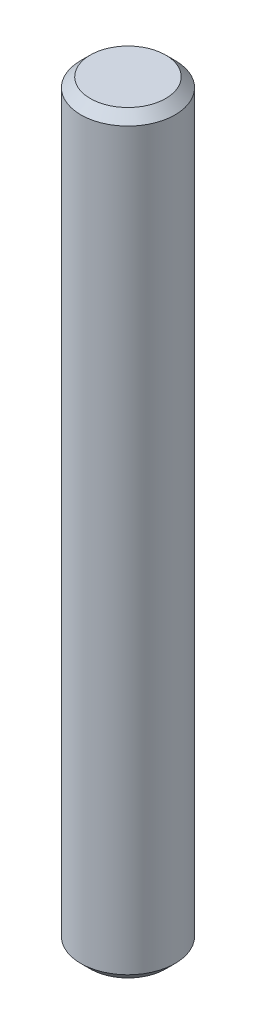
ISO-10303-21;
HEADER;
FILE_DESCRIPTION(('STEP AP214'),'2;1');
FILE_NAME('part.step','',(''),(''),'','','');
FILE_SCHEMA(('AUTOMOTIVE_DESIGN { 1 0 10303 214 1 1 1 1 }'));
ENDSEC;
DATA;
#1=APPLICATION_CONTEXT('core data for automotive mechanical design processes');
#2=APPLICATION_PROTOCOL_DEFINITION('international standard','automotive_design',2000,#1);
#3=PRODUCT_CONTEXT('',#1,'mechanical');
#4=PRODUCT('Part','Part','',(#3));
#5=PRODUCT_RELATED_PRODUCT_CATEGORY('part','',(#4));
#6=PRODUCT_DEFINITION_FORMATION('','',#4);
#7=PRODUCT_DEFINITION_CONTEXT('part definition',#1,'design');
#8=PRODUCT_DEFINITION('design','',#6,#7);
#9=PRODUCT_DEFINITION_SHAPE('','',#8);
#10=(LENGTH_UNIT() NAMED_UNIT(*) SI_UNIT(.MILLI.,.METRE.));
#11=(NAMED_UNIT(*) PLANE_ANGLE_UNIT() SI_UNIT($,.RADIAN.));
#12=(NAMED_UNIT(*) SI_UNIT($,.STERADIAN.) SOLID_ANGLE_UNIT());
#13=UNCERTAINTY_MEASURE_WITH_UNIT(LENGTH_MEASURE(1.E-05),#10,'distance_accuracy_value','');
#14=(GEOMETRIC_REPRESENTATION_CONTEXT(3) GLOBAL_UNCERTAINTY_ASSIGNED_CONTEXT((#13)) GLOBAL_UNIT_ASSIGNED_CONTEXT((#10,
#11,#12)) REPRESENTATION_CONTEXT('',''));
#15=CARTESIAN_POINT('',(0.,0.,0.));
#16=DIRECTION('',(0.,0.,1.));
#17=DIRECTION('',(1.,0.,0.));
#18=AXIS2_PLACEMENT_3D('',#15,#16,#17);
#19=CARTESIAN_POINT('',(0.,40.,0.));
#20=DIRECTION('',(0.,-1.,0.));
#21=DIRECTION('',(1.,0.,0.));
#22=AXIS2_PLACEMENT_3D('',#19,#20,#21);
#23=PLANE('',#22);
#24=CARTESIAN_POINT('',(0.,40.,0.));
#25=DIRECTION('',(0.,-1.,0.));
#26=DIRECTION('',(1.,0.,0.));
#27=AXIS2_PLACEMENT_3D('',#24,#25,#26);
#28=CIRCLE('',#27,4.00000000000002);
#29=CARTESIAN_POINT('',(4.,40.,0.));
#30=VERTEX_POINT('',#29);
#31=EDGE_CURVE('E10',#30,#30,#28,.F.);
#32=ORIENTED_EDGE('',*,*,#31,.T.);
#33=EDGE_LOOP('',(#32));
#34=FACE_BOUND('',#33,.T.);
#35=ADVANCED_FACE('F37',(#34),#23,.F.);
#36=CARTESIAN_POINT('',(0.,40.,0.));
#37=DIRECTION('',(0.,1.,0.));
#38=DIRECTION('',(-1.,0.,0.));
#39=AXIS2_PLACEMENT_3D('',#36,#37,#38);
#40=CYLINDRICAL_SURFACE('',#39,5.);
#41=CARTESIAN_POINT('',(0.,-39.,0.));
#42=DIRECTION('',(0.,1.,0.));
#43=DIRECTION('',(-1.,0.,0.));
#44=AXIS2_PLACEMENT_3D('',#41,#42,#43);
#45=CIRCLE('',#44,5.);
#46=CARTESIAN_POINT('',(-5.,-39.,0.));
#47=VERTEX_POINT('',#46);
#48=EDGE_CURVE('E49',#47,#47,#45,.T.);
#49=ORIENTED_EDGE('',*,*,#48,.T.);
#50=EDGE_LOOP('',(#49));
#51=FACE_BOUND('',#50,.T.);
#52=CARTESIAN_POINT('',(0.,39.,0.));
#53=DIRECTION('',(0.,-1.,0.));
#54=DIRECTION('',(1.,0.,0.));
#55=AXIS2_PLACEMENT_3D('',#52,#53,#54);
#56=CIRCLE('',#55,5.);
#57=CARTESIAN_POINT('',(4.99999999999999,39.,0.));
#58=VERTEX_POINT('',#57);
#59=EDGE_CURVE('E53',#58,#58,#56,.T.);
#60=ORIENTED_EDGE('',*,*,#59,.T.);
#61=EDGE_LOOP('',(#60));
#62=FACE_BOUND('',#61,.T.);
#63=ADVANCED_FACE('F59',(#51,#62),#40,.T.);
#64=CARTESIAN_POINT('',(5.00000000000001,-40.,0.));
#65=DIRECTION('',(0.,1.,0.));
#66=DIRECTION('',(-1.,0.,0.));
#67=AXIS2_PLACEMENT_3D('',#64,#65,#66);
#68=PLANE('',#67);
#69=CARTESIAN_POINT('',(0.,-40.,0.));
#70=DIRECTION('',(0.,1.,0.));
#71=DIRECTION('',(-1.,0.,0.));
#72=AXIS2_PLACEMENT_3D('',#69,#70,#71);
#73=CIRCLE('',#72,3.99999999999998);
#74=CARTESIAN_POINT('',(-3.99999999999997,-40.,0.));
#75=VERTEX_POINT('',#74);
#76=EDGE_CURVE('E45',#75,#75,#73,.F.);
#77=ORIENTED_EDGE('',*,*,#76,.T.);
#78=EDGE_LOOP('',(#77));
#79=FACE_BOUND('',#78,.T.);
#80=ADVANCED_FACE('F67',(#79),#68,.F.);
#81=CARTESIAN_POINT('',(0.,-39.,0.));
#82=DIRECTION('',(0.,1.,0.));
#83=DIRECTION('',(-1.,0.,0.));
#84=AXIS2_PLACEMENT_3D('',#81,#82,#83);
#85=CONICAL_SURFACE('',#84,5.,0.785398163397453);
#86=ORIENTED_EDGE('',*,*,#76,.F.);
#87=EDGE_LOOP('',(#86));
#88=FACE_BOUND('',#87,.T.);
#89=ORIENTED_EDGE('',*,*,#48,.F.);
#90=EDGE_LOOP('',(#89));
#91=FACE_BOUND('',#90,.T.);
#92=ADVANCED_FACE('F63',(#88,#91),#85,.T.);
#93=CARTESIAN_POINT('',(0.,40.,0.));
#94=DIRECTION('',(0.,-1.,0.));
#95=DIRECTION('',(1.,0.,0.));
#96=AXIS2_PLACEMENT_3D('',#93,#94,#95);
#97=CONICAL_SURFACE('',#96,4.00000000000002,0.785398163397446);
#98=ORIENTED_EDGE('',*,*,#59,.F.);
#99=EDGE_LOOP('',(#98));
#100=FACE_BOUND('',#99,.T.);
#101=ORIENTED_EDGE('',*,*,#31,.F.);
#102=EDGE_LOOP('',(#101));
#103=FACE_BOUND('',#102,.T.);
#104=ADVANCED_FACE('F40',(#100,#103),#97,.T.);
#105=CLOSED_SHELL('',(#35,#63,#80,#92,#104));
#106=MANIFOLD_SOLID_BREP('B2',#105);
#107=ADVANCED_BREP_SHAPE_REPRESENTATION('',(#18,#106),#14);
#108=SHAPE_DEFINITION_REPRESENTATION(#9,#107);
ENDSEC;
END-ISO-10303-21;
